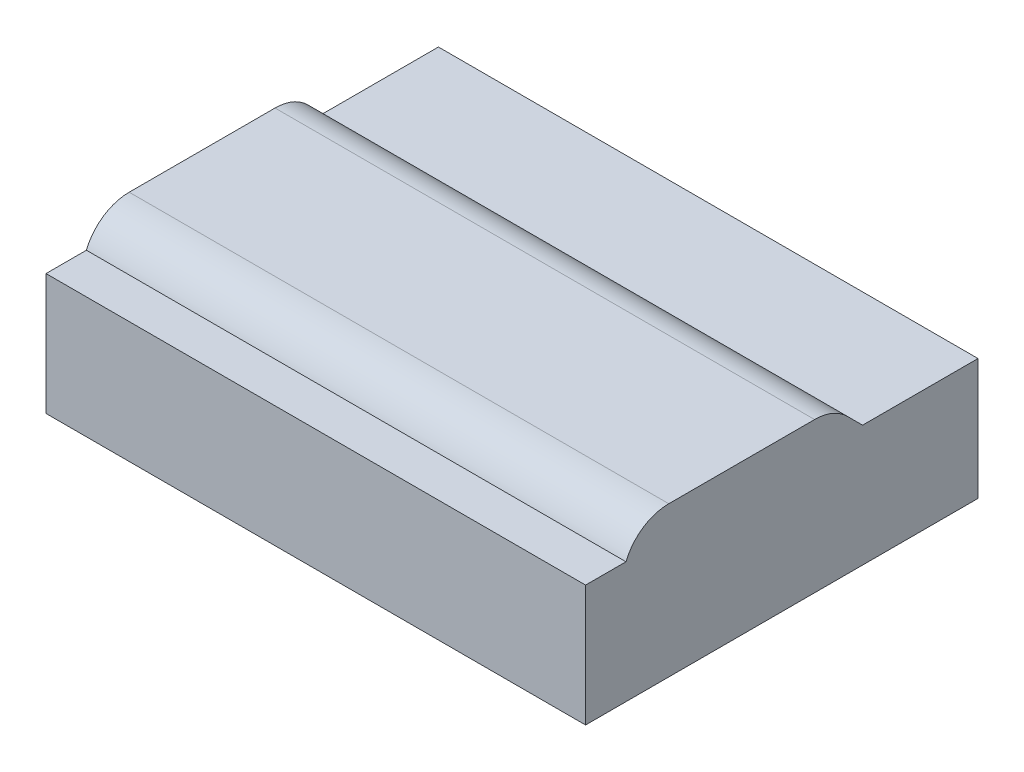
ISO-10303-21;
HEADER;
FILE_DESCRIPTION(('STEP AP214'),'2;1');
FILE_NAME('part.step','',(''),(''),'','','');
FILE_SCHEMA(('AUTOMOTIVE_DESIGN { 1 0 10303 214 1 1 1 1 }'));
ENDSEC;
DATA;
#1=APPLICATION_CONTEXT('core data for automotive mechanical design processes');
#2=APPLICATION_PROTOCOL_DEFINITION('international standard','automotive_design',2000,#1);
#3=PRODUCT_CONTEXT('',#1,'mechanical');
#4=PRODUCT('Part','Part','',(#3));
#5=PRODUCT_RELATED_PRODUCT_CATEGORY('part','',(#4));
#6=PRODUCT_DEFINITION_FORMATION('','',#4);
#7=PRODUCT_DEFINITION_CONTEXT('part definition',#1,'design');
#8=PRODUCT_DEFINITION('design','',#6,#7);
#9=PRODUCT_DEFINITION_SHAPE('','',#8);
#10=(LENGTH_UNIT() NAMED_UNIT(*) SI_UNIT(.MILLI.,.METRE.));
#11=(NAMED_UNIT(*) PLANE_ANGLE_UNIT() SI_UNIT($,.RADIAN.));
#12=(NAMED_UNIT(*) SI_UNIT($,.STERADIAN.) SOLID_ANGLE_UNIT());
#13=UNCERTAINTY_MEASURE_WITH_UNIT(LENGTH_MEASURE(1.E-05),#10,'distance_accuracy_value','');
#14=(GEOMETRIC_REPRESENTATION_CONTEXT(3) GLOBAL_UNCERTAINTY_ASSIGNED_CONTEXT((#13)) GLOBAL_UNIT_ASSIGNED_CONTEXT((#10,
#11,#12)) REPRESENTATION_CONTEXT('',''));
#15=CARTESIAN_POINT('',(0.,0.,0.));
#16=DIRECTION('',(0.,0.,1.));
#17=DIRECTION('',(1.,0.,0.));
#18=AXIS2_PLACEMENT_3D('',#15,#16,#17);
#19=CARTESIAN_POINT('',(0.,0.,0.));
#20=DIRECTION('',(0.,1.,0.));
#21=DIRECTION('',(0.,0.,1.));
#22=AXIS2_PLACEMENT_3D('',#19,#20,#21);
#23=PLANE('',#22);
#24=DIRECTION('',(0.,0.,-1.));
#25=VECTOR('',#24,1.);
#26=CARTESIAN_POINT('',(467.5,0.,-680.));
#27=LINE('',#26,#25);
#28=CARTESIAN_POINT('',(467.5,0.,0.));
#29=VERTEX_POINT('',#28);
#30=CARTESIAN_POINT('',(467.5,0.,-70.0000000000001));
#31=VERTEX_POINT('',#30);
#32=EDGE_CURVE('E176',#29,#31,#27,.T.);
#33=ORIENTED_EDGE('',*,*,#32,.T.);
#34=DIRECTION('',(-1.,0.,0.));
#35=VECTOR('',#34,1.);
#36=CARTESIAN_POINT('',(880.537528561268,0.,-70.));
#37=LINE('',#36,#35);
#38=CARTESIAN_POINT('',(-467.5,0.,-70.0000000000001));
#39=VERTEX_POINT('',#38);
#40=EDGE_CURVE('E130',#31,#39,#37,.T.);
#41=ORIENTED_EDGE('',*,*,#40,.T.);
#42=DIRECTION('',(0.,0.,1.));
#43=VECTOR('',#42,1.);
#44=CARTESIAN_POINT('',(-467.5,0.,-680.));
#45=LINE('',#44,#43);
#46=CARTESIAN_POINT('',(-467.5,0.,0.));
#47=VERTEX_POINT('',#46);
#48=EDGE_CURVE('E127',#39,#47,#45,.T.);
#49=ORIENTED_EDGE('',*,*,#48,.T.);
#50=DIRECTION('',(1.,0.,0.));
#51=VECTOR('',#50,1.);
#52=CARTESIAN_POINT('',(-467.5,0.,0.));
#53=LINE('',#52,#51);
#54=EDGE_CURVE('E126',#47,#29,#53,.T.);
#55=ORIENTED_EDGE('',*,*,#54,.T.);
#56=EDGE_LOOP('',(#33,#41,#49,#55));
#57=FACE_BOUND('',#56,.T.);
#58=ADVANCED_FACE('F37',(#57),#23,.T.);
#59=CARTESIAN_POINT('',(-467.5,-210.,-680.));
#60=DIRECTION('',(-1.,0.,0.));
#61=DIRECTION('',(0.,0.,1.));
#62=AXIS2_PLACEMENT_3D('',#59,#60,#61);
#63=PLANE('',#62);
#64=ORIENTED_EDGE('',*,*,#48,.F.);
#65=CARTESIAN_POINT('',(-467.5,-30.,-144.161984870957));
#66=DIRECTION('',(-1.,0.,0.));
#67=DIRECTION('',(0.,0.,1.));
#68=AXIS2_PLACEMENT_3D('',#65,#66,#67);
#69=CIRCLE('',#68,80.);
#70=CARTESIAN_POINT('',(-467.5,50.,-144.161984870957));
#71=VERTEX_POINT('',#70);
#72=EDGE_CURVE('E202',#39,#71,#69,.T.);
#73=ORIENTED_EDGE('',*,*,#72,.T.);
#74=DIRECTION('',(0.,0.,-1.));
#75=VECTOR('',#74,1.);
#76=CARTESIAN_POINT('',(-467.5,50.,0.));
#77=LINE('',#76,#75);
#78=CARTESIAN_POINT('',(-467.5,50.,-396.862915010153));
#79=VERTEX_POINT('',#78);
#80=EDGE_CURVE('E117',#71,#79,#77,.T.);
#81=ORIENTED_EDGE('',*,*,#80,.T.);
#82=CARTESIAN_POINT('',(-467.5,-30.,-396.862915010153));
#83=DIRECTION('',(-1.,0.,0.));
#84=DIRECTION('',(0.,0.,1.));
#85=AXIS2_PLACEMENT_3D('',#82,#83,#84);
#86=CIRCLE('',#85,80.);
#87=CARTESIAN_POINT('',(-467.5,26.5685424949238,-453.431457505076));
#88=VERTEX_POINT('',#87);
#89=EDGE_CURVE('E114',#79,#88,#86,.T.);
#90=ORIENTED_EDGE('',*,*,#89,.T.);
#91=DIRECTION('',(0.,-0.707106781186547,-0.707106781186548));
#92=VECTOR('',#91,1.);
#93=CARTESIAN_POINT('',(-467.5,240.,-240.));
#94=LINE('',#93,#92);
#95=CARTESIAN_POINT('',(-467.5,0.,-480.));
#96=VERTEX_POINT('',#95);
#97=EDGE_CURVE('E107',#88,#96,#94,.T.);
#98=ORIENTED_EDGE('',*,*,#97,.T.);
#99=CARTESIAN_POINT('',(-467.5,0.,-680.));
#100=VERTEX_POINT('',#99);
#101=EDGE_CURVE('E111',#100,#96,#45,.T.);
#102=ORIENTED_EDGE('',*,*,#101,.F.);
#103=DIRECTION('',(0.,1.,0.));
#104=VECTOR('',#103,1.);
#105=CARTESIAN_POINT('',(-467.5,-210.,-680.));
#106=LINE('',#105,#104);
#107=CARTESIAN_POINT('',(-467.5,-210.,-680.));
#108=VERTEX_POINT('',#107);
#109=EDGE_CURVE('E174',#108,#100,#106,.T.);
#110=ORIENTED_EDGE('',*,*,#109,.F.);
#111=DIRECTION('',(0.,0.,1.));
#112=VECTOR('',#111,1.);
#113=CARTESIAN_POINT('',(-467.5,-210.,-680.));
#114=LINE('',#113,#112);
#115=CARTESIAN_POINT('',(-467.5,-210.,0.));
#116=VERTEX_POINT('',#115);
#117=EDGE_CURVE('E149',#108,#116,#114,.T.);
#118=ORIENTED_EDGE('',*,*,#117,.T.);
#119=DIRECTION('',(0.,1.,0.));
#120=VECTOR('',#119,1.);
#121=CARTESIAN_POINT('',(-467.5,-210.,0.));
#122=LINE('',#121,#120);
#123=EDGE_CURVE('E161',#116,#47,#122,.T.);
#124=ORIENTED_EDGE('',*,*,#123,.T.);
#125=EDGE_LOOP('',(#64,#73,#81,#90,#98,#102,#110,#118,#124));
#126=FACE_BOUND('',#125,.T.);
#127=ADVANCED_FACE('F110',(#126),#63,.T.);
#128=CARTESIAN_POINT('',(-467.5,-210.,-680.));
#129=DIRECTION('',(0.,0.,-1.));
#130=DIRECTION('',(-1.,0.,0.));
#131=AXIS2_PLACEMENT_3D('',#128,#129,#130);
#132=PLANE('',#131);
#133=DIRECTION('',(-1.,0.,0.));
#134=VECTOR('',#133,1.);
#135=CARTESIAN_POINT('',(-467.5,0.,-680.));
#136=LINE('',#135,#134);
#137=CARTESIAN_POINT('',(467.5,0.,-680.));
#138=VERTEX_POINT('',#137);
#139=EDGE_CURVE('E125',#138,#100,#136,.T.);
#140=ORIENTED_EDGE('',*,*,#139,.F.);
#141=DIRECTION('',(0.,1.,0.));
#142=VECTOR('',#141,1.);
#143=CARTESIAN_POINT('',(467.5,-210.,-680.));
#144=LINE('',#143,#142);
#145=CARTESIAN_POINT('',(467.5,-210.,-680.));
#146=VERTEX_POINT('',#145);
#147=EDGE_CURVE('E171',#146,#138,#144,.T.);
#148=ORIENTED_EDGE('',*,*,#147,.F.);
#149=DIRECTION('',(-1.,0.,0.));
#150=VECTOR('',#149,1.);
#151=CARTESIAN_POINT('',(-467.5,-210.,-680.));
#152=LINE('',#151,#150);
#153=EDGE_CURVE('E158',#146,#108,#152,.T.);
#154=ORIENTED_EDGE('',*,*,#153,.T.);
#155=ORIENTED_EDGE('',*,*,#109,.T.);
#156=EDGE_LOOP('',(#140,#148,#154,#155));
#157=FACE_BOUND('',#156,.T.);
#158=ADVANCED_FACE('F218',(#157),#132,.T.);
#159=CARTESIAN_POINT('',(467.5,-210.,-680.));
#160=DIRECTION('',(1.,0.,0.));
#161=DIRECTION('',(0.,0.,-1.));
#162=AXIS2_PLACEMENT_3D('',#159,#160,#161);
#163=PLANE('',#162);
#164=DIRECTION('',(0.,0.,-1.));
#165=VECTOR('',#164,1.);
#166=CARTESIAN_POINT('',(467.5,50.,1.4588570261514E-13));
#167=LINE('',#166,#165);
#168=CARTESIAN_POINT('',(467.5,50.,-144.161984870957));
#169=VERTEX_POINT('',#168);
#170=CARTESIAN_POINT('',(467.5,50.,-396.862915010152));
#171=VERTEX_POINT('',#170);
#172=EDGE_CURVE('E133',#169,#171,#167,.T.);
#173=ORIENTED_EDGE('',*,*,#172,.F.);
#174=CARTESIAN_POINT('',(467.5,-30.,-144.161984870957));
#175=DIRECTION('',(1.,0.,0.));
#176=DIRECTION('',(0.,0.,-1.));
#177=AXIS2_PLACEMENT_3D('',#174,#175,#176);
#178=CIRCLE('',#177,80.);
#179=EDGE_CURVE('E45',#169,#31,#178,.T.);
#180=ORIENTED_EDGE('',*,*,#179,.T.);
#181=ORIENTED_EDGE('',*,*,#32,.F.);
#182=DIRECTION('',(0.,1.,0.));
#183=VECTOR('',#182,1.);
#184=CARTESIAN_POINT('',(467.5,-210.,0.));
#185=LINE('',#184,#183);
#186=CARTESIAN_POINT('',(467.5,-210.,0.));
#187=VERTEX_POINT('',#186);
#188=EDGE_CURVE('E169',#187,#29,#185,.T.);
#189=ORIENTED_EDGE('',*,*,#188,.F.);
#190=DIRECTION('',(0.,0.,-1.));
#191=VECTOR('',#190,1.);
#192=CARTESIAN_POINT('',(467.5,-210.,-680.));
#193=LINE('',#192,#191);
#194=EDGE_CURVE('E155',#187,#146,#193,.T.);
#195=ORIENTED_EDGE('',*,*,#194,.T.);
#196=ORIENTED_EDGE('',*,*,#147,.T.);
#197=CARTESIAN_POINT('',(467.5,0.,-480.));
#198=VERTEX_POINT('',#197);
#199=EDGE_CURVE('E139',#198,#138,#27,.T.);
#200=ORIENTED_EDGE('',*,*,#199,.F.);
#201=DIRECTION('',(0.,-0.707106781186547,-0.707106781186548));
#202=VECTOR('',#201,1.);
#203=CARTESIAN_POINT('',(467.5,240.,-240.));
#204=LINE('',#203,#202);
#205=CARTESIAN_POINT('',(467.5,26.5685424949237,-453.431457505076));
#206=VERTEX_POINT('',#205);
#207=EDGE_CURVE('E116',#206,#198,#204,.T.);
#208=ORIENTED_EDGE('',*,*,#207,.F.);
#209=CARTESIAN_POINT('',(467.5,-30.,-396.862915010152));
#210=DIRECTION('',(1.,0.,0.));
#211=DIRECTION('',(0.,0.,-1.));
#212=AXIS2_PLACEMENT_3D('',#209,#210,#211);
#213=CIRCLE('',#212,80.);
#214=EDGE_CURVE('E57',#206,#171,#213,.T.);
#215=ORIENTED_EDGE('',*,*,#214,.T.);
#216=EDGE_LOOP('',(#173,#180,#181,#189,#195,#196,#200,#208,#215));
#217=FACE_BOUND('',#216,.T.);
#218=ADVANCED_FACE('F189',(#217),#163,.T.);
#219=CARTESIAN_POINT('',(-467.5,-210.,0.));
#220=DIRECTION('',(0.,0.,1.));
#221=DIRECTION('',(1.,0.,0.));
#222=AXIS2_PLACEMENT_3D('',#219,#220,#221);
#223=PLANE('',#222);
#224=ORIENTED_EDGE('',*,*,#54,.F.);
#225=ORIENTED_EDGE('',*,*,#123,.F.);
#226=DIRECTION('',(1.,0.,0.));
#227=VECTOR('',#226,1.);
#228=CARTESIAN_POINT('',(-467.5,-210.,0.));
#229=LINE('',#228,#227);
#230=EDGE_CURVE('E152',#116,#187,#229,.T.);
#231=ORIENTED_EDGE('',*,*,#230,.T.);
#232=ORIENTED_EDGE('',*,*,#188,.T.);
#233=EDGE_LOOP('',(#224,#225,#231,#232));
#234=FACE_BOUND('',#233,.T.);
#235=ADVANCED_FACE('F186',(#234),#223,.T.);
#236=CARTESIAN_POINT('',(0.,-210.,0.));
#237=DIRECTION('',(0.,1.,0.));
#238=DIRECTION('',(0.,0.,1.));
#239=AXIS2_PLACEMENT_3D('',#236,#237,#238);
#240=PLANE('',#239);
#241=ORIENTED_EDGE('',*,*,#117,.F.);
#242=ORIENTED_EDGE('',*,*,#153,.F.);
#243=ORIENTED_EDGE('',*,*,#194,.F.);
#244=ORIENTED_EDGE('',*,*,#230,.F.);
#245=EDGE_LOOP('',(#241,#242,#243,#244));
#246=FACE_BOUND('',#245,.T.);
#247=ADVANCED_FACE('F216',(#246),#240,.F.);
#248=DIRECTION('',(-1.,0.,0.));
#249=VECTOR('',#248,1.);
#250=CARTESIAN_POINT('',(880.537528561268,0.,-480.));
#251=LINE('',#250,#249);
#252=EDGE_CURVE('E122',#198,#96,#251,.T.);
#253=ORIENTED_EDGE('',*,*,#252,.F.);
#254=ORIENTED_EDGE('',*,*,#199,.T.);
#255=ORIENTED_EDGE('',*,*,#139,.T.);
#256=ORIENTED_EDGE('',*,*,#101,.T.);
#257=EDGE_LOOP('',(#253,#254,#255,#256));
#258=FACE_BOUND('',#257,.T.);
#259=ADVANCED_FACE('F121',(#258),#23,.T.);
#260=CARTESIAN_POINT('',(880.537528561268,240.,-240.));
#261=DIRECTION('',(0.,0.707106781186548,-0.707106781186547));
#262=DIRECTION('',(0.,0.707106781186547,0.707106781186548));
#263=AXIS2_PLACEMENT_3D('',#260,#261,#262);
#264=PLANE('',#263);
#265=ORIENTED_EDGE('',*,*,#97,.F.);
#266=DIRECTION('',(-1.,0.,0.));
#267=VECTOR('',#266,1.);
#268=CARTESIAN_POINT('',(880.537528561268,26.5685424949238,-453.431457505076));
#269=LINE('',#268,#267);
#270=EDGE_CURVE('E11',#88,#206,#269,.F.);
#271=ORIENTED_EDGE('',*,*,#270,.T.);
#272=ORIENTED_EDGE('',*,*,#207,.T.);
#273=ORIENTED_EDGE('',*,*,#252,.T.);
#274=EDGE_LOOP('',(#265,#271,#272,#273));
#275=FACE_BOUND('',#274,.T.);
#276=ADVANCED_FACE('F129',(#275),#264,.T.);
#277=CARTESIAN_POINT('',(880.537528561268,50.,0.));
#278=DIRECTION('',(0.,1.,0.));
#279=DIRECTION('',(0.,0.,1.));
#280=AXIS2_PLACEMENT_3D('',#277,#278,#279);
#281=PLANE('',#280);
#282=ORIENTED_EDGE('',*,*,#80,.F.);
#283=DIRECTION('',(1.,0.,0.));
#284=VECTOR('',#283,1.);
#285=CARTESIAN_POINT('',(467.5,50.,-144.161984870957));
#286=LINE('',#285,#284);
#287=EDGE_CURVE('E194',#71,#169,#286,.T.);
#288=ORIENTED_EDGE('',*,*,#287,.T.);
#289=ORIENTED_EDGE('',*,*,#172,.T.);
#290=DIRECTION('',(-1.,0.,0.));
#291=VECTOR('',#290,1.);
#292=CARTESIAN_POINT('',(880.537528561268,50.,-396.862915010152));
#293=LINE('',#292,#291);
#294=EDGE_CURVE('E204',#171,#79,#293,.T.);
#295=ORIENTED_EDGE('',*,*,#294,.T.);
#296=EDGE_LOOP('',(#282,#288,#289,#295));
#297=FACE_BOUND('',#296,.T.);
#298=ADVANCED_FACE('F210',(#297),#281,.T.);
#299=CARTESIAN_POINT('',(880.537528561268,-30.,-144.161984870957));
#300=DIRECTION('',(-1.,0.,0.));
#301=DIRECTION('',(0.,0.,1.));
#302=AXIS2_PLACEMENT_3D('',#299,#300,#301);
#303=CYLINDRICAL_SURFACE('',#302,80.);
#304=ORIENTED_EDGE('',*,*,#179,.F.);
#305=ORIENTED_EDGE('',*,*,#287,.F.);
#306=ORIENTED_EDGE('',*,*,#72,.F.);
#307=ORIENTED_EDGE('',*,*,#40,.F.);
#308=EDGE_LOOP('',(#304,#305,#306,#307));
#309=FACE_BOUND('',#308,.T.);
#310=ADVANCED_FACE('F211',(#309),#303,.T.);
#311=CARTESIAN_POINT('',(880.537528561268,-30.,-396.862915010152));
#312=DIRECTION('',(-1.,0.,0.));
#313=DIRECTION('',(0.,0.,1.));
#314=AXIS2_PLACEMENT_3D('',#311,#312,#313);
#315=CYLINDRICAL_SURFACE('',#314,80.);
#316=ORIENTED_EDGE('',*,*,#214,.F.);
#317=ORIENTED_EDGE('',*,*,#270,.F.);
#318=ORIENTED_EDGE('',*,*,#89,.F.);
#319=ORIENTED_EDGE('',*,*,#294,.F.);
#320=EDGE_LOOP('',(#316,#317,#318,#319));
#321=FACE_BOUND('',#320,.T.);
#322=ADVANCED_FACE('F39',(#321),#315,.T.);
#323=CLOSED_SHELL('',(#58,#127,#158,#218,#235,#247,#259,#276,#298,#310,#322));
#324=MANIFOLD_SOLID_BREP('B2',#323);
#325=ADVANCED_BREP_SHAPE_REPRESENTATION('',(#18,#324),#14);
#326=SHAPE_DEFINITION_REPRESENTATION(#9,#325);
ENDSEC;
END-ISO-10303-21;
